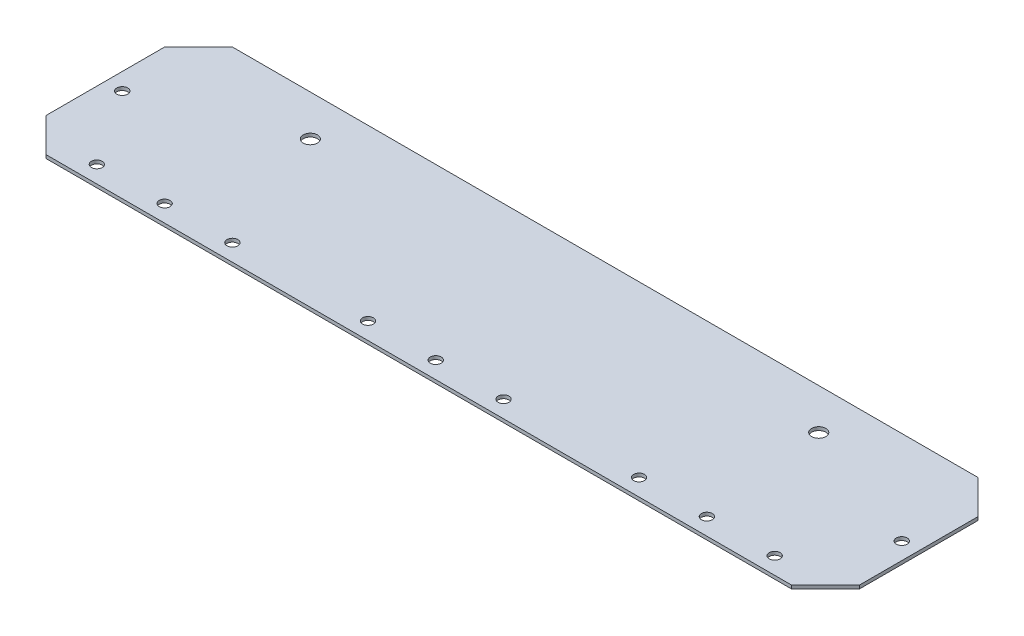
ISO-10303-21;
HEADER;
FILE_DESCRIPTION(('STEP AP214'),'2;1');
FILE_NAME('part.step','',(''),(''),'','','');
FILE_SCHEMA(('AUTOMOTIVE_DESIGN { 1 0 10303 214 1 1 1 1 }'));
ENDSEC;
DATA;
#1=APPLICATION_CONTEXT('core data for automotive mechanical design processes');
#2=APPLICATION_PROTOCOL_DEFINITION('international standard','automotive_design',2000,#1);
#3=PRODUCT_CONTEXT('',#1,'mechanical');
#4=PRODUCT('Part','Part','',(#3));
#5=PRODUCT_RELATED_PRODUCT_CATEGORY('part','',(#4));
#6=PRODUCT_DEFINITION_FORMATION('','',#4);
#7=PRODUCT_DEFINITION_CONTEXT('part definition',#1,'design');
#8=PRODUCT_DEFINITION('design','',#6,#7);
#9=PRODUCT_DEFINITION_SHAPE('','',#8);
#10=(LENGTH_UNIT() NAMED_UNIT(*) SI_UNIT(.MILLI.,.METRE.));
#11=(NAMED_UNIT(*) PLANE_ANGLE_UNIT() SI_UNIT($,.RADIAN.));
#12=(NAMED_UNIT(*) SI_UNIT($,.STERADIAN.) SOLID_ANGLE_UNIT());
#13=UNCERTAINTY_MEASURE_WITH_UNIT(LENGTH_MEASURE(1.E-05),#10,'distance_accuracy_value','');
#14=(GEOMETRIC_REPRESENTATION_CONTEXT(3) GLOBAL_UNCERTAINTY_ASSIGNED_CONTEXT((#13)) GLOBAL_UNIT_ASSIGNED_CONTEXT((#10,
#11,#12)) REPRESENTATION_CONTEXT('',''));
#15=CARTESIAN_POINT('',(0.,0.,0.));
#16=DIRECTION('',(0.,0.,1.));
#17=DIRECTION('',(1.,0.,0.));
#18=AXIS2_PLACEMENT_3D('',#15,#16,#17);
#19=CARTESIAN_POINT('',(0.,1.,0.));
#20=DIRECTION('',(1.,0.,0.));
#21=DIRECTION('',(0.,0.,-1.));
#22=AXIS2_PLACEMENT_3D('',#19,#20,#21);
#23=PLANE('',#22);
#24=DIRECTION('',(0.,0.,1.));
#25=VECTOR('',#24,1.);
#26=CARTESIAN_POINT('',(0.,1.,0.));
#27=LINE('',#26,#25);
#28=CARTESIAN_POINT('',(0.,1.,-45.));
#29=VERTEX_POINT('',#28);
#30=CARTESIAN_POINT('',(0.,1.,-10.));
#31=VERTEX_POINT('',#30);
#32=EDGE_CURVE('E131',#29,#31,#27,.T.);
#33=ORIENTED_EDGE('',*,*,#32,.F.);
#34=DIRECTION('',(0.,-1.,0.));
#35=VECTOR('',#34,1.);
#36=CARTESIAN_POINT('',(0.,1.,-45.));
#37=LINE('',#36,#35);
#38=CARTESIAN_POINT('',(0.,0.,-45.));
#39=VERTEX_POINT('',#38);
#40=EDGE_CURVE('E119',#29,#39,#37,.T.);
#41=ORIENTED_EDGE('',*,*,#40,.T.);
#42=DIRECTION('',(0.,0.,1.));
#43=VECTOR('',#42,1.);
#44=CARTESIAN_POINT('',(0.,0.,0.));
#45=LINE('',#44,#43);
#46=CARTESIAN_POINT('',(0.,0.,-10.));
#47=VERTEX_POINT('',#46);
#48=EDGE_CURVE('E135',#39,#47,#45,.T.);
#49=ORIENTED_EDGE('',*,*,#48,.T.);
#50=DIRECTION('',(0.,1.,0.));
#51=VECTOR('',#50,1.);
#52=CARTESIAN_POINT('',(0.,1.,-10.));
#53=LINE('',#52,#51);
#54=EDGE_CURVE('E137',#47,#31,#53,.T.);
#55=ORIENTED_EDGE('',*,*,#54,.T.);
#56=EDGE_LOOP('',(#33,#41,#49,#55));
#57=FACE_BOUND('',#56,.T.);
#58=ADVANCED_FACE('F50',(#57),#23,.F.);
#59=CARTESIAN_POINT('',(0.,1.,0.));
#60=DIRECTION('',(0.,0.,-1.));
#61=DIRECTION('',(-1.,0.,0.));
#62=AXIS2_PLACEMENT_3D('',#59,#60,#61);
#63=PLANE('',#62);
#64=DIRECTION('',(1.,0.,0.));
#65=VECTOR('',#64,1.);
#66=CARTESIAN_POINT('',(0.,0.,0.));
#67=LINE('',#66,#65);
#68=CARTESIAN_POINT('',(10.,0.,0.));
#69=VERTEX_POINT('',#68);
#70=CARTESIAN_POINT('',(230.,0.,0.));
#71=VERTEX_POINT('',#70);
#72=EDGE_CURVE('E145',#69,#71,#67,.T.);
#73=ORIENTED_EDGE('',*,*,#72,.T.);
#74=DIRECTION('',(0.,1.,0.));
#75=VECTOR('',#74,1.);
#76=CARTESIAN_POINT('',(230.,1.,0.));
#77=LINE('',#76,#75);
#78=CARTESIAN_POINT('',(230.,1.,0.));
#79=VERTEX_POINT('',#78);
#80=EDGE_CURVE('E11',#71,#79,#77,.T.);
#81=ORIENTED_EDGE('',*,*,#80,.T.);
#82=DIRECTION('',(1.,0.,0.));
#83=VECTOR('',#82,1.);
#84=CARTESIAN_POINT('',(0.,1.,0.));
#85=LINE('',#84,#83);
#86=CARTESIAN_POINT('',(10.,1.,0.));
#87=VERTEX_POINT('',#86);
#88=EDGE_CURVE('E199',#87,#79,#85,.T.);
#89=ORIENTED_EDGE('',*,*,#88,.F.);
#90=DIRECTION('',(0.,-1.,0.));
#91=VECTOR('',#90,1.);
#92=CARTESIAN_POINT('',(10.,1.,0.));
#93=LINE('',#92,#91);
#94=EDGE_CURVE('E60',#87,#69,#93,.T.);
#95=ORIENTED_EDGE('',*,*,#94,.T.);
#96=EDGE_LOOP('',(#73,#81,#89,#95));
#97=FACE_BOUND('',#96,.T.);
#98=ADVANCED_FACE('F196',(#97),#63,.F.);
#99=CARTESIAN_POINT('',(240.,1.,0.));
#100=DIRECTION('',(-1.,0.,0.));
#101=DIRECTION('',(0.,0.,1.));
#102=AXIS2_PLACEMENT_3D('',#99,#100,#101);
#103=PLANE('',#102);
#104=DIRECTION('',(0.,0.,-1.));
#105=VECTOR('',#104,1.);
#106=CARTESIAN_POINT('',(240.,1.,0.));
#107=LINE('',#106,#105);
#108=CARTESIAN_POINT('',(240.,1.,-10.));
#109=VERTEX_POINT('',#108);
#110=CARTESIAN_POINT('',(240.,1.,-44.9999999999999));
#111=VERTEX_POINT('',#110);
#112=EDGE_CURVE('E208',#109,#111,#107,.T.);
#113=ORIENTED_EDGE('',*,*,#112,.F.);
#114=DIRECTION('',(0.,-1.,0.));
#115=VECTOR('',#114,1.);
#116=CARTESIAN_POINT('',(240.,1.,-10.));
#117=LINE('',#116,#115);
#118=CARTESIAN_POINT('',(240.,0.,-10.));
#119=VERTEX_POINT('',#118);
#120=EDGE_CURVE('E186',#109,#119,#117,.T.);
#121=ORIENTED_EDGE('',*,*,#120,.T.);
#122=DIRECTION('',(0.,0.,-1.));
#123=VECTOR('',#122,1.);
#124=CARTESIAN_POINT('',(240.,0.,0.));
#125=LINE('',#124,#123);
#126=CARTESIAN_POINT('',(240.,0.,-44.9999999999999));
#127=VERTEX_POINT('',#126);
#128=EDGE_CURVE('E147',#119,#127,#125,.T.);
#129=ORIENTED_EDGE('',*,*,#128,.T.);
#130=DIRECTION('',(0.,1.,0.));
#131=VECTOR('',#130,1.);
#132=CARTESIAN_POINT('',(240.,1.,-44.9999999999999));
#133=LINE('',#132,#131);
#134=EDGE_CURVE('E64',#127,#111,#133,.T.);
#135=ORIENTED_EDGE('',*,*,#134,.T.);
#136=EDGE_LOOP('',(#113,#121,#129,#135));
#137=FACE_BOUND('',#136,.T.);
#138=ADVANCED_FACE('F210',(#137),#103,.F.);
#139=CARTESIAN_POINT('',(0.,1.,-55.));
#140=DIRECTION('',(0.,0.,1.));
#141=DIRECTION('',(1.,0.,0.));
#142=AXIS2_PLACEMENT_3D('',#139,#140,#141);
#143=PLANE('',#142);
#144=DIRECTION('',(-1.,0.,0.));
#145=VECTOR('',#144,1.);
#146=CARTESIAN_POINT('',(0.,0.,-55.));
#147=LINE('',#146,#145);
#148=CARTESIAN_POINT('',(230.,0.,-55.));
#149=VERTEX_POINT('',#148);
#150=CARTESIAN_POINT('',(10.,0.,-55.));
#151=VERTEX_POINT('',#150);
#152=EDGE_CURVE('E161',#149,#151,#147,.T.);
#153=ORIENTED_EDGE('',*,*,#152,.T.);
#154=DIRECTION('',(0.,1.,0.));
#155=VECTOR('',#154,1.);
#156=CARTESIAN_POINT('',(10.,1.,-55.));
#157=LINE('',#156,#155);
#158=CARTESIAN_POINT('',(10.,1.,-55.));
#159=VERTEX_POINT('',#158);
#160=EDGE_CURVE('E116',#151,#159,#157,.T.);
#161=ORIENTED_EDGE('',*,*,#160,.T.);
#162=DIRECTION('',(-1.,0.,0.));
#163=VECTOR('',#162,1.);
#164=CARTESIAN_POINT('',(0.,1.,-55.));
#165=LINE('',#164,#163);
#166=CARTESIAN_POINT('',(230.,1.,-55.));
#167=VERTEX_POINT('',#166);
#168=EDGE_CURVE('E156',#167,#159,#165,.T.);
#169=ORIENTED_EDGE('',*,*,#168,.F.);
#170=DIRECTION('',(0.,-1.,0.));
#171=VECTOR('',#170,1.);
#172=CARTESIAN_POINT('',(230.,1.,-55.));
#173=LINE('',#172,#171);
#174=EDGE_CURVE('E127',#167,#149,#173,.T.);
#175=ORIENTED_EDGE('',*,*,#174,.T.);
#176=EDGE_LOOP('',(#153,#161,#169,#175));
#177=FACE_BOUND('',#176,.T.);
#178=ADVANCED_FACE('F336',(#177),#143,.F.);
#179=CARTESIAN_POINT('',(0.,1.,0.));
#180=DIRECTION('',(0.,-1.,0.));
#181=DIRECTION('',(0.,0.,-1.));
#182=AXIS2_PLACEMENT_3D('',#179,#180,#181);
#183=PLANE('',#182);
#184=CARTESIAN_POINT('',(180.,0.999999999999999,-5.));
#185=DIRECTION('',(0.,-1.,0.));
#186=DIRECTION('',(0.,0.,-1.));
#187=AXIS2_PLACEMENT_3D('',#184,#185,#186);
#188=CIRCLE('',#187,1.60000000000002);
#189=CARTESIAN_POINT('',(180.,0.999999999999999,-6.60000000000002));
#190=VERTEX_POINT('',#189);
#191=EDGE_CURVE('E144',#190,#190,#188,.T.);
#192=ORIENTED_EDGE('',*,*,#191,.T.);
#193=EDGE_LOOP('',(#192));
#194=FACE_BOUND('',#193,.T.);
#195=CARTESIAN_POINT('',(140.,0.999999999999999,-5.));
#196=DIRECTION('',(0.,-1.,0.));
#197=DIRECTION('',(0.,0.,-1.));
#198=AXIS2_PLACEMENT_3D('',#195,#196,#197);
#199=CIRCLE('',#198,1.60000000000002);
#200=CARTESIAN_POINT('',(140.,0.999999999999999,-6.60000000000002));
#201=VERTEX_POINT('',#200);
#202=EDGE_CURVE('E153',#201,#201,#199,.T.);
#203=ORIENTED_EDGE('',*,*,#202,.T.);
#204=EDGE_LOOP('',(#203));
#205=FACE_BOUND('',#204,.T.);
#206=CARTESIAN_POINT('',(100.,0.999999999999999,-5.));
#207=DIRECTION('',(0.,-1.,0.));
#208=DIRECTION('',(0.,0.,-1.));
#209=AXIS2_PLACEMENT_3D('',#206,#207,#208);
#210=CIRCLE('',#209,1.60000000000002);
#211=CARTESIAN_POINT('',(100.,0.999999999999999,-6.60000000000002));
#212=VERTEX_POINT('',#211);
#213=EDGE_CURVE('E222',#212,#212,#210,.T.);
#214=ORIENTED_EDGE('',*,*,#213,.T.);
#215=EDGE_LOOP('',(#214));
#216=FACE_BOUND('',#215,.T.);
#217=CARTESIAN_POINT('',(60.,0.999999999999999,-5.));
#218=DIRECTION('',(0.,-1.,0.));
#219=DIRECTION('',(0.,0.,-1.));
#220=AXIS2_PLACEMENT_3D('',#217,#218,#219);
#221=CIRCLE('',#220,1.60000000000001);
#222=CARTESIAN_POINT('',(60.,0.999999999999999,-6.60000000000001));
#223=VERTEX_POINT('',#222);
#224=EDGE_CURVE('E223',#223,#223,#221,.T.);
#225=ORIENTED_EDGE('',*,*,#224,.T.);
#226=EDGE_LOOP('',(#225));
#227=FACE_BOUND('',#226,.T.);
#228=CARTESIAN_POINT('',(20.,0.999999999999999,-5.));
#229=DIRECTION('',(0.,-1.,0.));
#230=DIRECTION('',(0.,0.,-1.));
#231=AXIS2_PLACEMENT_3D('',#228,#229,#230);
#232=CIRCLE('',#231,1.60000000000001);
#233=CARTESIAN_POINT('',(20.,0.999999999999999,-6.60000000000001));
#234=VERTEX_POINT('',#233);
#235=EDGE_CURVE('E229',#234,#234,#232,.T.);
#236=ORIENTED_EDGE('',*,*,#235,.T.);
#237=EDGE_LOOP('',(#236));
#238=FACE_BOUND('',#237,.T.);
#239=CARTESIAN_POINT('',(5.,0.999999999999999,-27.5));
#240=DIRECTION('',(0.,-1.,0.));
#241=DIRECTION('',(0.,0.,-1.));
#242=AXIS2_PLACEMENT_3D('',#239,#240,#241);
#243=CIRCLE('',#242,1.6);
#244=CARTESIAN_POINT('',(5.,0.999999999999999,-29.1));
#245=VERTEX_POINT('',#244);
#246=EDGE_CURVE('E232',#245,#245,#243,.T.);
#247=ORIENTED_EDGE('',*,*,#246,.T.);
#248=EDGE_LOOP('',(#247));
#249=FACE_BOUND('',#248,.T.);
#250=CARTESIAN_POINT('',(235.,0.999999999999999,-27.5));
#251=DIRECTION('',(0.,-1.,0.));
#252=DIRECTION('',(0.,0.,-1.));
#253=AXIS2_PLACEMENT_3D('',#250,#251,#252);
#254=CIRCLE('',#253,1.59999999999999);
#255=CARTESIAN_POINT('',(235.,0.999999999999999,-29.1));
#256=VERTEX_POINT('',#255);
#257=EDGE_CURVE('E240',#256,#256,#254,.T.);
#258=ORIENTED_EDGE('',*,*,#257,.T.);
#259=EDGE_LOOP('',(#258));
#260=FACE_BOUND('',#259,.T.);
#261=CARTESIAN_POINT('',(45.,0.999999999999999,-43.));
#262=DIRECTION('',(0.,-1.,0.));
#263=DIRECTION('',(0.,0.,-1.));
#264=AXIS2_PLACEMENT_3D('',#261,#262,#263);
#265=CIRCLE('',#264,2.1);
#266=CARTESIAN_POINT('',(45.,0.999999999999999,-45.1));
#267=VERTEX_POINT('',#266);
#268=EDGE_CURVE('E242',#267,#267,#265,.T.);
#269=ORIENTED_EDGE('',*,*,#268,.T.);
#270=EDGE_LOOP('',(#269));
#271=FACE_BOUND('',#270,.T.);
#272=CARTESIAN_POINT('',(200.,0.999999999999999,-5.));
#273=DIRECTION('',(0.,-1.,0.));
#274=DIRECTION('',(0.,0.,-1.));
#275=AXIS2_PLACEMENT_3D('',#272,#273,#274);
#276=CIRCLE('',#275,1.60000000000002);
#277=CARTESIAN_POINT('',(200.,0.999999999999999,-6.60000000000002));
#278=VERTEX_POINT('',#277);
#279=EDGE_CURVE('E241',#278,#278,#276,.T.);
#280=ORIENTED_EDGE('',*,*,#279,.T.);
#281=EDGE_LOOP('',(#280));
#282=FACE_BOUND('',#281,.T.);
#283=CARTESIAN_POINT('',(120.,0.999999999999999,-5.));
#284=DIRECTION('',(0.,-1.,0.));
#285=DIRECTION('',(0.,0.,-1.));
#286=AXIS2_PLACEMENT_3D('',#283,#284,#285);
#287=CIRCLE('',#286,1.60000000000001);
#288=CARTESIAN_POINT('',(120.,0.999999999999999,-6.60000000000001));
#289=VERTEX_POINT('',#288);
#290=EDGE_CURVE('E250',#289,#289,#287,.T.);
#291=ORIENTED_EDGE('',*,*,#290,.T.);
#292=EDGE_LOOP('',(#291));
#293=FACE_BOUND('',#292,.T.);
#294=CARTESIAN_POINT('',(40.,0.999999999999999,-5.));
#295=DIRECTION('',(0.,-1.,0.));
#296=DIRECTION('',(0.,0.,-1.));
#297=AXIS2_PLACEMENT_3D('',#294,#295,#296);
#298=CIRCLE('',#297,1.60000000000001);
#299=CARTESIAN_POINT('',(40.,0.999999999999999,-6.60000000000001));
#300=VERTEX_POINT('',#299);
#301=EDGE_CURVE('E251',#300,#300,#298,.T.);
#302=ORIENTED_EDGE('',*,*,#301,.T.);
#303=EDGE_LOOP('',(#302));
#304=FACE_BOUND('',#303,.T.);
#305=CARTESIAN_POINT('',(220.,0.999999999999999,-5.));
#306=DIRECTION('',(0.,-1.,0.));
#307=DIRECTION('',(0.,0.,-1.));
#308=AXIS2_PLACEMENT_3D('',#305,#306,#307);
#309=CIRCLE('',#308,1.60000000000005);
#310=CARTESIAN_POINT('',(220.,0.999999999999999,-6.60000000000005));
#311=VERTEX_POINT('',#310);
#312=EDGE_CURVE('E260',#311,#311,#309,.T.);
#313=ORIENTED_EDGE('',*,*,#312,.T.);
#314=EDGE_LOOP('',(#313));
#315=FACE_BOUND('',#314,.T.);
#316=CARTESIAN_POINT('',(195.,0.999999999999999,-43.));
#317=DIRECTION('',(0.,-1.,0.));
#318=DIRECTION('',(0.,0.,-1.));
#319=AXIS2_PLACEMENT_3D('',#316,#317,#318);
#320=CIRCLE('',#319,2.09999999999999);
#321=CARTESIAN_POINT('',(195.,0.999999999999999,-45.1));
#322=VERTEX_POINT('',#321);
#323=EDGE_CURVE('E261',#322,#322,#320,.T.);
#324=ORIENTED_EDGE('',*,*,#323,.T.);
#325=EDGE_LOOP('',(#324));
#326=FACE_BOUND('',#325,.T.);
#327=ORIENTED_EDGE('',*,*,#168,.T.);
#328=DIRECTION('',(0.707106781186549,0.,-0.707106781186547));
#329=VECTOR('',#328,1.);
#330=CARTESIAN_POINT('',(0.,1.,-45.));
#331=LINE('',#330,#329);
#332=EDGE_CURVE('E183',#159,#29,#331,.F.);
#333=ORIENTED_EDGE('',*,*,#332,.T.);
#334=ORIENTED_EDGE('',*,*,#32,.T.);
#335=DIRECTION('',(-0.707106781186547,0.,-0.707106781186549));
#336=VECTOR('',#335,1.);
#337=CARTESIAN_POINT('',(10.,1.,0.));
#338=LINE('',#337,#336);
#339=EDGE_CURVE('E176',#31,#87,#338,.F.);
#340=ORIENTED_EDGE('',*,*,#339,.T.);
#341=ORIENTED_EDGE('',*,*,#88,.T.);
#342=DIRECTION('',(-0.707106781186549,0.,0.707106781186547));
#343=VECTOR('',#342,1.);
#344=CARTESIAN_POINT('',(240.,1.,-10.));
#345=LINE('',#344,#343);
#346=EDGE_CURVE('E72',#79,#109,#345,.F.);
#347=ORIENTED_EDGE('',*,*,#346,.T.);
#348=ORIENTED_EDGE('',*,*,#112,.T.);
#349=DIRECTION('',(0.707106781186547,0.,0.707106781186549));
#350=VECTOR('',#349,1.);
#351=CARTESIAN_POINT('',(230.,1.,-55.));
#352=LINE('',#351,#350);
#353=EDGE_CURVE('E179',#111,#167,#352,.F.);
#354=ORIENTED_EDGE('',*,*,#353,.T.);
#355=EDGE_LOOP('',(#327,#333,#334,#340,#341,#347,#348,#354));
#356=FACE_BOUND('',#355,.T.);
#357=ADVANCED_FACE('F323',(#194,#205,#216,#227,#238,#249,#260,#271,#282,#293,#304,#315,#326,
#356),#183,.F.);
#358=CARTESIAN_POINT('',(0.,0.,0.));
#359=DIRECTION('',(0.,-1.,0.));
#360=DIRECTION('',(0.,0.,-1.));
#361=AXIS2_PLACEMENT_3D('',#358,#359,#360);
#362=PLANE('',#361);
#363=CARTESIAN_POINT('',(180.,0.,-5.));
#364=DIRECTION('',(0.,-1.,0.));
#365=DIRECTION('',(0.,0.,1.));
#366=AXIS2_PLACEMENT_3D('',#363,#364,#365);
#367=CIRCLE('',#366,1.60000000000002);
#368=CARTESIAN_POINT('',(180.,0.,-3.39999999999998));
#369=VERTEX_POINT('',#368);
#370=EDGE_CURVE('E288',#369,#369,#367,.T.);
#371=ORIENTED_EDGE('',*,*,#370,.F.);
#372=EDGE_LOOP('',(#371));
#373=FACE_BOUND('',#372,.T.);
#374=CARTESIAN_POINT('',(140.,0.,-5.));
#375=DIRECTION('',(0.,-1.,0.));
#376=DIRECTION('',(0.,0.,1.));
#377=AXIS2_PLACEMENT_3D('',#374,#375,#376);
#378=CIRCLE('',#377,1.60000000000002);
#379=CARTESIAN_POINT('',(140.,0.,-3.39999999999998));
#380=VERTEX_POINT('',#379);
#381=EDGE_CURVE('E286',#380,#380,#378,.T.);
#382=ORIENTED_EDGE('',*,*,#381,.F.);
#383=EDGE_LOOP('',(#382));
#384=FACE_BOUND('',#383,.T.);
#385=CARTESIAN_POINT('',(100.,0.,-5.));
#386=DIRECTION('',(0.,-1.,0.));
#387=DIRECTION('',(0.,0.,-1.));
#388=AXIS2_PLACEMENT_3D('',#385,#386,#387);
#389=CIRCLE('',#388,1.60000000000002);
#390=CARTESIAN_POINT('',(100.,0.,-6.60000000000002));
#391=VERTEX_POINT('',#390);
#392=EDGE_CURVE('E293',#391,#391,#389,.T.);
#393=ORIENTED_EDGE('',*,*,#392,.F.);
#394=EDGE_LOOP('',(#393));
#395=FACE_BOUND('',#394,.T.);
#396=CARTESIAN_POINT('',(60.,0.,-5.));
#397=DIRECTION('',(0.,-1.,0.));
#398=DIRECTION('',(0.,0.,-1.));
#399=AXIS2_PLACEMENT_3D('',#396,#397,#398);
#400=CIRCLE('',#399,1.60000000000001);
#401=CARTESIAN_POINT('',(60.,0.,-6.60000000000001));
#402=VERTEX_POINT('',#401);
#403=EDGE_CURVE('E274',#402,#402,#400,.T.);
#404=ORIENTED_EDGE('',*,*,#403,.F.);
#405=EDGE_LOOP('',(#404));
#406=FACE_BOUND('',#405,.T.);
#407=CARTESIAN_POINT('',(20.,0.,-5.));
#408=DIRECTION('',(0.,-1.,0.));
#409=DIRECTION('',(0.,0.,-1.));
#410=AXIS2_PLACEMENT_3D('',#407,#408,#409);
#411=CIRCLE('',#410,1.60000000000001);
#412=CARTESIAN_POINT('',(20.,0.,-6.60000000000001));
#413=VERTEX_POINT('',#412);
#414=EDGE_CURVE('E269',#413,#413,#411,.T.);
#415=ORIENTED_EDGE('',*,*,#414,.F.);
#416=EDGE_LOOP('',(#415));
#417=FACE_BOUND('',#416,.T.);
#418=CARTESIAN_POINT('',(5.,0.,-27.5));
#419=DIRECTION('',(0.,-1.,0.));
#420=DIRECTION('',(0.,0.,-1.));
#421=AXIS2_PLACEMENT_3D('',#418,#419,#420);
#422=CIRCLE('',#421,1.6);
#423=CARTESIAN_POINT('',(5.,0.,-29.1));
#424=VERTEX_POINT('',#423);
#425=EDGE_CURVE('E273',#424,#424,#422,.T.);
#426=ORIENTED_EDGE('',*,*,#425,.F.);
#427=EDGE_LOOP('',(#426));
#428=FACE_BOUND('',#427,.T.);
#429=CARTESIAN_POINT('',(235.,0.,-27.5));
#430=DIRECTION('',(0.,-1.,0.));
#431=DIRECTION('',(0.,0.,-1.));
#432=AXIS2_PLACEMENT_3D('',#429,#430,#431);
#433=CIRCLE('',#432,1.59999999999999);
#434=CARTESIAN_POINT('',(235.,0.,-29.1));
#435=VERTEX_POINT('',#434);
#436=EDGE_CURVE('E276',#435,#435,#433,.T.);
#437=ORIENTED_EDGE('',*,*,#436,.F.);
#438=EDGE_LOOP('',(#437));
#439=FACE_BOUND('',#438,.T.);
#440=CARTESIAN_POINT('',(45.,0.,-43.));
#441=DIRECTION('',(0.,-1.,0.));
#442=DIRECTION('',(0.,0.,-1.));
#443=AXIS2_PLACEMENT_3D('',#440,#441,#442);
#444=CIRCLE('',#443,2.1);
#445=CARTESIAN_POINT('',(45.,0.,-45.1));
#446=VERTEX_POINT('',#445);
#447=EDGE_CURVE('E267',#446,#446,#444,.T.);
#448=ORIENTED_EDGE('',*,*,#447,.F.);
#449=EDGE_LOOP('',(#448));
#450=FACE_BOUND('',#449,.T.);
#451=CARTESIAN_POINT('',(200.,0.,-5.));
#452=DIRECTION('',(0.,-1.,0.));
#453=DIRECTION('',(0.,0.,-1.));
#454=AXIS2_PLACEMENT_3D('',#451,#452,#453);
#455=CIRCLE('',#454,1.60000000000002);
#456=CARTESIAN_POINT('',(200.,0.,-6.60000000000002));
#457=VERTEX_POINT('',#456);
#458=EDGE_CURVE('E309',#457,#457,#455,.T.);
#459=ORIENTED_EDGE('',*,*,#458,.F.);
#460=EDGE_LOOP('',(#459));
#461=FACE_BOUND('',#460,.T.);
#462=CARTESIAN_POINT('',(120.,0.,-5.));
#463=DIRECTION('',(0.,-1.,0.));
#464=DIRECTION('',(0.,0.,-1.));
#465=AXIS2_PLACEMENT_3D('',#462,#463,#464);
#466=CIRCLE('',#465,1.60000000000001);
#467=CARTESIAN_POINT('',(120.,0.,-6.60000000000001));
#468=VERTEX_POINT('',#467);
#469=EDGE_CURVE('E308',#468,#468,#466,.T.);
#470=ORIENTED_EDGE('',*,*,#469,.F.);
#471=EDGE_LOOP('',(#470));
#472=FACE_BOUND('',#471,.T.);
#473=CARTESIAN_POINT('',(40.,0.,-5.));
#474=DIRECTION('',(0.,-1.,0.));
#475=DIRECTION('',(0.,0.,-1.));
#476=AXIS2_PLACEMENT_3D('',#473,#474,#475);
#477=CIRCLE('',#476,1.60000000000001);
#478=CARTESIAN_POINT('',(40.,0.,-6.60000000000001));
#479=VERTEX_POINT('',#478);
#480=EDGE_CURVE('E304',#479,#479,#477,.T.);
#481=ORIENTED_EDGE('',*,*,#480,.F.);
#482=EDGE_LOOP('',(#481));
#483=FACE_BOUND('',#482,.T.);
#484=CARTESIAN_POINT('',(220.,0.,-5.));
#485=DIRECTION('',(0.,-1.,0.));
#486=DIRECTION('',(0.,0.,1.));
#487=AXIS2_PLACEMENT_3D('',#484,#485,#486);
#488=CIRCLE('',#487,1.60000000000005);
#489=CARTESIAN_POINT('',(220.,0.,-3.39999999999996));
#490=VERTEX_POINT('',#489);
#491=EDGE_CURVE('E292',#490,#490,#488,.T.);
#492=ORIENTED_EDGE('',*,*,#491,.F.);
#493=EDGE_LOOP('',(#492));
#494=FACE_BOUND('',#493,.T.);
#495=CARTESIAN_POINT('',(195.,0.,-43.));
#496=DIRECTION('',(0.,-1.,0.));
#497=DIRECTION('',(0.,0.,-1.));
#498=AXIS2_PLACEMENT_3D('',#495,#496,#497);
#499=CIRCLE('',#498,2.09999999999999);
#500=CARTESIAN_POINT('',(195.,0.,-45.1));
#501=VERTEX_POINT('',#500);
#502=EDGE_CURVE('E264',#501,#501,#499,.T.);
#503=ORIENTED_EDGE('',*,*,#502,.F.);
#504=EDGE_LOOP('',(#503));
#505=FACE_BOUND('',#504,.T.);
#506=ORIENTED_EDGE('',*,*,#48,.F.);
#507=DIRECTION('',(-0.707106781186549,0.,0.707106781186547));
#508=VECTOR('',#507,1.);
#509=CARTESIAN_POINT('',(-22.5,0.,-22.5000000000001));
#510=LINE('',#509,#508);
#511=EDGE_CURVE('E113',#39,#151,#510,.F.);
#512=ORIENTED_EDGE('',*,*,#511,.T.);
#513=ORIENTED_EDGE('',*,*,#152,.F.);
#514=DIRECTION('',(-0.707106781186547,0.,-0.707106781186549));
#515=VECTOR('',#514,1.);
#516=CARTESIAN_POINT('',(142.5,0.,-142.5));
#517=LINE('',#516,#515);
#518=EDGE_CURVE('E139',#149,#127,#517,.F.);
#519=ORIENTED_EDGE('',*,*,#518,.T.);
#520=ORIENTED_EDGE('',*,*,#128,.F.);
#521=DIRECTION('',(0.707106781186549,0.,-0.707106781186547));
#522=VECTOR('',#521,1.);
#523=CARTESIAN_POINT('',(115.,0.,115.));
#524=LINE('',#523,#522);
#525=EDGE_CURVE('E130',#119,#71,#524,.F.);
#526=ORIENTED_EDGE('',*,*,#525,.T.);
#527=ORIENTED_EDGE('',*,*,#72,.F.);
#528=DIRECTION('',(0.707106781186547,0.,0.707106781186549));
#529=VECTOR('',#528,1.);
#530=CARTESIAN_POINT('',(5.00000000000002,0.,-5.00000000000001));
#531=LINE('',#530,#529);
#532=EDGE_CURVE('E142',#69,#47,#531,.F.);
#533=ORIENTED_EDGE('',*,*,#532,.T.);
#534=EDGE_LOOP('',(#506,#512,#513,#519,#520,#526,#527,#533));
#535=FACE_BOUND('',#534,.T.);
#536=ADVANCED_FACE('F136',(#373,#384,#395,#406,#417,#428,#439,#450,#461,#472,#483,#494,#505,
#535),#362,.T.);
#537=CARTESIAN_POINT('',(0.,1.,-45.));
#538=DIRECTION('',(0.707106781186547,0.,0.707106781186549));
#539=DIRECTION('',(0.,-1.,0.));
#540=AXIS2_PLACEMENT_3D('',#537,#538,#539);
#541=PLANE('',#540);
#542=ORIENTED_EDGE('',*,*,#332,.F.);
#543=ORIENTED_EDGE('',*,*,#160,.F.);
#544=ORIENTED_EDGE('',*,*,#511,.F.);
#545=ORIENTED_EDGE('',*,*,#40,.F.);
#546=EDGE_LOOP('',(#542,#543,#544,#545));
#547=FACE_BOUND('',#546,.T.);
#548=ADVANCED_FACE('F118',(#547),#541,.F.);
#549=CARTESIAN_POINT('',(240.,1.,-10.));
#550=DIRECTION('',(-0.707106781186547,0.,-0.707106781186549));
#551=DIRECTION('',(0.,-1.,0.));
#552=AXIS2_PLACEMENT_3D('',#549,#550,#551);
#553=PLANE('',#552);
#554=ORIENTED_EDGE('',*,*,#346,.F.);
#555=ORIENTED_EDGE('',*,*,#80,.F.);
#556=ORIENTED_EDGE('',*,*,#525,.F.);
#557=ORIENTED_EDGE('',*,*,#120,.F.);
#558=EDGE_LOOP('',(#554,#555,#556,#557));
#559=FACE_BOUND('',#558,.T.);
#560=ADVANCED_FACE('F206',(#559),#553,.F.);
#561=CARTESIAN_POINT('',(10.,1.,0.));
#562=DIRECTION('',(0.707106781186549,0.,-0.707106781186547));
#563=DIRECTION('',(0.,-1.,0.));
#564=AXIS2_PLACEMENT_3D('',#561,#562,#563);
#565=PLANE('',#564);
#566=ORIENTED_EDGE('',*,*,#339,.F.);
#567=ORIENTED_EDGE('',*,*,#54,.F.);
#568=ORIENTED_EDGE('',*,*,#532,.F.);
#569=ORIENTED_EDGE('',*,*,#94,.F.);
#570=EDGE_LOOP('',(#566,#567,#568,#569));
#571=FACE_BOUND('',#570,.T.);
#572=ADVANCED_FACE('F346',(#571),#565,.F.);
#573=CARTESIAN_POINT('',(230.,1.,-55.));
#574=DIRECTION('',(-0.707106781186548,0.,0.707106781186546));
#575=DIRECTION('',(0.,-1.,0.));
#576=AXIS2_PLACEMENT_3D('',#573,#574,#575);
#577=PLANE('',#576);
#578=ORIENTED_EDGE('',*,*,#353,.F.);
#579=ORIENTED_EDGE('',*,*,#134,.F.);
#580=ORIENTED_EDGE('',*,*,#518,.F.);
#581=ORIENTED_EDGE('',*,*,#174,.F.);
#582=EDGE_LOOP('',(#578,#579,#580,#581));
#583=FACE_BOUND('',#582,.T.);
#584=ADVANCED_FACE('F49',(#583),#577,.F.);
#585=CARTESIAN_POINT('',(195.,10.,-43.));
#586=DIRECTION('',(0.,-1.,0.));
#587=DIRECTION('',(0.,0.,-1.));
#588=AXIS2_PLACEMENT_3D('',#585,#586,#587);
#589=CYLINDRICAL_SURFACE('',#588,2.09999999999999);
#590=ORIENTED_EDGE('',*,*,#502,.T.);
#591=EDGE_LOOP('',(#590));
#592=FACE_BOUND('',#591,.T.);
#593=ORIENTED_EDGE('',*,*,#323,.F.);
#594=EDGE_LOOP('',(#593));
#595=FACE_BOUND('',#594,.T.);
#596=ADVANCED_FACE('F335',(#592,#595),#589,.F.);
#597=CARTESIAN_POINT('',(220.,10.,-5.));
#598=DIRECTION('',(0.,-1.,0.));
#599=DIRECTION('',(0.,0.,-1.));
#600=AXIS2_PLACEMENT_3D('',#597,#598,#599);
#601=CYLINDRICAL_SURFACE('',#600,1.60000000000005);
#602=ORIENTED_EDGE('',*,*,#491,.T.);
#603=EDGE_LOOP('',(#602));
#604=FACE_BOUND('',#603,.T.);
#605=ORIENTED_EDGE('',*,*,#312,.F.);
#606=EDGE_LOOP('',(#605));
#607=FACE_BOUND('',#606,.T.);
#608=ADVANCED_FACE('F333',(#604,#607),#601,.F.);
#609=CARTESIAN_POINT('',(40.,10.,-5.));
#610=DIRECTION('',(0.,-1.,0.));
#611=DIRECTION('',(0.,0.,-1.));
#612=AXIS2_PLACEMENT_3D('',#609,#610,#611);
#613=CYLINDRICAL_SURFACE('',#612,1.60000000000001);
#614=ORIENTED_EDGE('',*,*,#480,.T.);
#615=EDGE_LOOP('',(#614));
#616=FACE_BOUND('',#615,.T.);
#617=ORIENTED_EDGE('',*,*,#301,.F.);
#618=EDGE_LOOP('',(#617));
#619=FACE_BOUND('',#618,.T.);
#620=ADVANCED_FACE('F404',(#616,#619),#613,.F.);
#621=CARTESIAN_POINT('',(120.,10.,-5.));
#622=DIRECTION('',(0.,-1.,0.));
#623=DIRECTION('',(0.,0.,-1.));
#624=AXIS2_PLACEMENT_3D('',#621,#622,#623);
#625=CYLINDRICAL_SURFACE('',#624,1.60000000000001);
#626=ORIENTED_EDGE('',*,*,#469,.T.);
#627=EDGE_LOOP('',(#626));
#628=FACE_BOUND('',#627,.T.);
#629=ORIENTED_EDGE('',*,*,#290,.F.);
#630=EDGE_LOOP('',(#629));
#631=FACE_BOUND('',#630,.T.);
#632=ADVANCED_FACE('F318',(#628,#631),#625,.F.);
#633=CARTESIAN_POINT('',(200.,10.,-5.));
#634=DIRECTION('',(0.,-1.,0.));
#635=DIRECTION('',(0.,0.,-1.));
#636=AXIS2_PLACEMENT_3D('',#633,#634,#635);
#637=CYLINDRICAL_SURFACE('',#636,1.60000000000002);
#638=ORIENTED_EDGE('',*,*,#458,.T.);
#639=EDGE_LOOP('',(#638));
#640=FACE_BOUND('',#639,.T.);
#641=ORIENTED_EDGE('',*,*,#279,.F.);
#642=EDGE_LOOP('',(#641));
#643=FACE_BOUND('',#642,.T.);
#644=ADVANCED_FACE('F421',(#640,#643),#637,.F.);
#645=CARTESIAN_POINT('',(45.,10.,-43.));
#646=DIRECTION('',(0.,-1.,0.));
#647=DIRECTION('',(0.,0.,-1.));
#648=AXIS2_PLACEMENT_3D('',#645,#646,#647);
#649=CYLINDRICAL_SURFACE('',#648,2.1);
#650=ORIENTED_EDGE('',*,*,#447,.T.);
#651=EDGE_LOOP('',(#650));
#652=FACE_BOUND('',#651,.T.);
#653=ORIENTED_EDGE('',*,*,#268,.F.);
#654=EDGE_LOOP('',(#653));
#655=FACE_BOUND('',#654,.T.);
#656=ADVANCED_FACE('F435',(#652,#655),#649,.F.);
#657=CARTESIAN_POINT('',(235.,10.,-27.5));
#658=DIRECTION('',(0.,-1.,0.));
#659=DIRECTION('',(0.,0.,-1.));
#660=AXIS2_PLACEMENT_3D('',#657,#658,#659);
#661=CYLINDRICAL_SURFACE('',#660,1.59999999999999);
#662=ORIENTED_EDGE('',*,*,#436,.T.);
#663=EDGE_LOOP('',(#662));
#664=FACE_BOUND('',#663,.T.);
#665=ORIENTED_EDGE('',*,*,#257,.F.);
#666=EDGE_LOOP('',(#665));
#667=FACE_BOUND('',#666,.T.);
#668=ADVANCED_FACE('F445',(#664,#667),#661,.F.);
#669=CARTESIAN_POINT('',(5.,10.,-27.5));
#670=DIRECTION('',(0.,-1.,0.));
#671=DIRECTION('',(0.,0.,-1.));
#672=AXIS2_PLACEMENT_3D('',#669,#670,#671);
#673=CYLINDRICAL_SURFACE('',#672,1.6);
#674=ORIENTED_EDGE('',*,*,#425,.T.);
#675=EDGE_LOOP('',(#674));
#676=FACE_BOUND('',#675,.T.);
#677=ORIENTED_EDGE('',*,*,#246,.F.);
#678=EDGE_LOOP('',(#677));
#679=FACE_BOUND('',#678,.T.);
#680=ADVANCED_FACE('F454',(#676,#679),#673,.F.);
#681=CARTESIAN_POINT('',(20.,10.,-5.));
#682=DIRECTION('',(0.,-1.,0.));
#683=DIRECTION('',(0.,0.,-1.));
#684=AXIS2_PLACEMENT_3D('',#681,#682,#683);
#685=CYLINDRICAL_SURFACE('',#684,1.60000000000001);
#686=ORIENTED_EDGE('',*,*,#414,.T.);
#687=EDGE_LOOP('',(#686));
#688=FACE_BOUND('',#687,.T.);
#689=ORIENTED_EDGE('',*,*,#235,.F.);
#690=EDGE_LOOP('',(#689));
#691=FACE_BOUND('',#690,.T.);
#692=ADVANCED_FACE('F465',(#688,#691),#685,.F.);
#693=CARTESIAN_POINT('',(60.,10.,-5.));
#694=DIRECTION('',(0.,-1.,0.));
#695=DIRECTION('',(0.,0.,-1.));
#696=AXIS2_PLACEMENT_3D('',#693,#694,#695);
#697=CYLINDRICAL_SURFACE('',#696,1.60000000000001);
#698=ORIENTED_EDGE('',*,*,#403,.T.);
#699=EDGE_LOOP('',(#698));
#700=FACE_BOUND('',#699,.T.);
#701=ORIENTED_EDGE('',*,*,#224,.F.);
#702=EDGE_LOOP('',(#701));
#703=FACE_BOUND('',#702,.T.);
#704=ADVANCED_FACE('F472',(#700,#703),#697,.F.);
#705=CARTESIAN_POINT('',(100.,10.,-5.));
#706=DIRECTION('',(0.,-1.,0.));
#707=DIRECTION('',(0.,0.,-1.));
#708=AXIS2_PLACEMENT_3D('',#705,#706,#707);
#709=CYLINDRICAL_SURFACE('',#708,1.60000000000002);
#710=ORIENTED_EDGE('',*,*,#392,.T.);
#711=EDGE_LOOP('',(#710));
#712=FACE_BOUND('',#711,.T.);
#713=ORIENTED_EDGE('',*,*,#213,.F.);
#714=EDGE_LOOP('',(#713));
#715=FACE_BOUND('',#714,.T.);
#716=ADVANCED_FACE('F485',(#712,#715),#709,.F.);
#717=CARTESIAN_POINT('',(140.,10.,-5.));
#718=DIRECTION('',(0.,-1.,0.));
#719=DIRECTION('',(0.,0.,-1.));
#720=AXIS2_PLACEMENT_3D('',#717,#718,#719);
#721=CYLINDRICAL_SURFACE('',#720,1.60000000000002);
#722=ORIENTED_EDGE('',*,*,#381,.T.);
#723=EDGE_LOOP('',(#722));
#724=FACE_BOUND('',#723,.T.);
#725=ORIENTED_EDGE('',*,*,#202,.F.);
#726=EDGE_LOOP('',(#725));
#727=FACE_BOUND('',#726,.T.);
#728=ADVANCED_FACE('F495',(#724,#727),#721,.F.);
#729=CARTESIAN_POINT('',(180.,10.,-5.));
#730=DIRECTION('',(0.,-1.,0.));
#731=DIRECTION('',(0.,0.,-1.));
#732=AXIS2_PLACEMENT_3D('',#729,#730,#731);
#733=CYLINDRICAL_SURFACE('',#732,1.60000000000002);
#734=ORIENTED_EDGE('',*,*,#370,.T.);
#735=EDGE_LOOP('',(#734));
#736=FACE_BOUND('',#735,.T.);
#737=ORIENTED_EDGE('',*,*,#191,.F.);
#738=EDGE_LOOP('',(#737));
#739=FACE_BOUND('',#738,.T.);
#740=ADVANCED_FACE('F505',(#736,#739),#733,.F.);
#741=CLOSED_SHELL('',(#58,#98,#138,#178,#357,#536,#548,#560,#572,#584,#596,#608,#620,#632,#644,
#656,#668,#680,#692,#704,#716,#728,#740));
#742=MANIFOLD_SOLID_BREP('B2',#741);
#743=ADVANCED_BREP_SHAPE_REPRESENTATION('',(#18,#742),#14);
#744=SHAPE_DEFINITION_REPRESENTATION(#9,#743);
ENDSEC;
END-ISO-10303-21;
